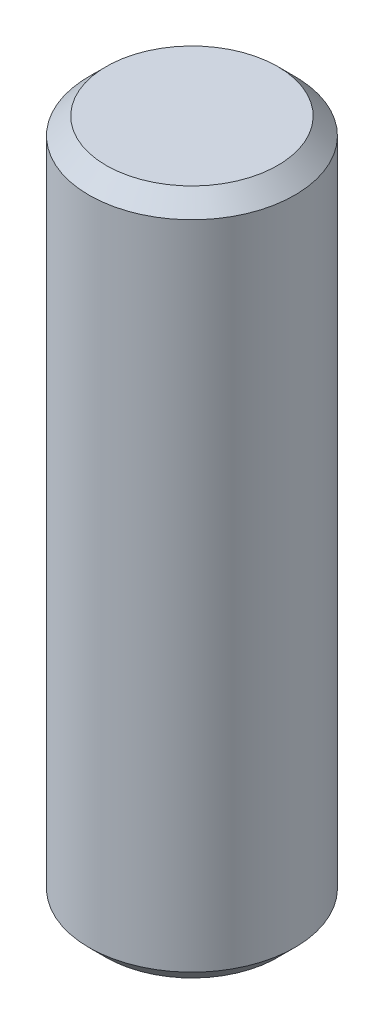
ISO-10303-21;
HEADER;
FILE_DESCRIPTION(('STEP AP214'),'2;1');
FILE_NAME('part.step','',(''),(''),'','','');
FILE_SCHEMA(('AUTOMOTIVE_DESIGN { 1 0 10303 214 1 1 1 1 }'));
ENDSEC;
DATA;
#1=APPLICATION_CONTEXT('core data for automotive mechanical design processes');
#2=APPLICATION_PROTOCOL_DEFINITION('international standard','automotive_design',2000,#1);
#3=PRODUCT_CONTEXT('',#1,'mechanical');
#4=PRODUCT('Part','Part','',(#3));
#5=PRODUCT_RELATED_PRODUCT_CATEGORY('part','',(#4));
#6=PRODUCT_DEFINITION_FORMATION('','',#4);
#7=PRODUCT_DEFINITION_CONTEXT('part definition',#1,'design');
#8=PRODUCT_DEFINITION('design','',#6,#7);
#9=PRODUCT_DEFINITION_SHAPE('','',#8);
#10=(LENGTH_UNIT() NAMED_UNIT(*) SI_UNIT(.MILLI.,.METRE.));
#11=(NAMED_UNIT(*) PLANE_ANGLE_UNIT() SI_UNIT($,.RADIAN.));
#12=(NAMED_UNIT(*) SI_UNIT($,.STERADIAN.) SOLID_ANGLE_UNIT());
#13=UNCERTAINTY_MEASURE_WITH_UNIT(LENGTH_MEASURE(1.E-05),#10,'distance_accuracy_value','');
#14=(GEOMETRIC_REPRESENTATION_CONTEXT(3) GLOBAL_UNCERTAINTY_ASSIGNED_CONTEXT((#13)) GLOBAL_UNIT_ASSIGNED_CONTEXT((#10,
#11,#12)) REPRESENTATION_CONTEXT('',''));
#15=CARTESIAN_POINT('',(0.,0.,0.));
#16=DIRECTION('',(0.,0.,1.));
#17=DIRECTION('',(1.,0.,0.));
#18=AXIS2_PLACEMENT_3D('',#15,#16,#17);
#19=CARTESIAN_POINT('',(0.,10.,0.));
#20=DIRECTION('',(0.,-1.,0.));
#21=DIRECTION('',(0.,0.,-1.));
#22=AXIS2_PLACEMENT_3D('',#19,#20,#21);
#23=CYLINDRICAL_SURFACE('',#22,3.);
#24=CARTESIAN_POINT('',(0.,-9.5,0.));
#25=DIRECTION('',(0.,1.,0.));
#26=DIRECTION('',(0.,0.,1.));
#27=AXIS2_PLACEMENT_3D('',#24,#25,#26);
#28=CIRCLE('',#27,3.);
#29=CARTESIAN_POINT('',(0.,-9.5,3.));
#30=VERTEX_POINT('',#29);
#31=EDGE_CURVE('E53',#30,#30,#28,.T.);
#32=ORIENTED_EDGE('',*,*,#31,.T.);
#33=EDGE_LOOP('',(#32));
#34=FACE_BOUND('',#33,.T.);
#35=CARTESIAN_POINT('',(0.,9.5,0.));
#36=DIRECTION('',(0.,1.,0.));
#37=DIRECTION('',(0.,0.,1.));
#38=AXIS2_PLACEMENT_3D('',#35,#36,#37);
#39=CIRCLE('',#38,3.);
#40=CARTESIAN_POINT('',(0.,9.5,3.));
#41=VERTEX_POINT('',#40);
#42=EDGE_CURVE('E57',#41,#41,#39,.F.);
#43=ORIENTED_EDGE('',*,*,#42,.T.);
#44=EDGE_LOOP('',(#43));
#45=FACE_BOUND('',#44,.T.);
#46=ADVANCED_FACE('F41',(#34,#45),#23,.T.);
#47=CARTESIAN_POINT('',(0.,10.,0.));
#48=DIRECTION('',(0.,1.,0.));
#49=DIRECTION('',(0.,0.,1.));
#50=AXIS2_PLACEMENT_3D('',#47,#48,#49);
#51=PLANE('',#50);
#52=CARTESIAN_POINT('',(0.,10.,0.));
#53=DIRECTION('',(0.,1.,0.));
#54=DIRECTION('',(0.,0.,1.));
#55=AXIS2_PLACEMENT_3D('',#52,#53,#54);
#56=CIRCLE('',#55,2.5);
#57=CARTESIAN_POINT('',(0.,10.,2.5));
#58=VERTEX_POINT('',#57);
#59=EDGE_CURVE('E10',#58,#58,#56,.T.);
#60=ORIENTED_EDGE('',*,*,#59,.T.);
#61=EDGE_LOOP('',(#60));
#62=FACE_BOUND('',#61,.T.);
#63=ADVANCED_FACE('F73',(#62),#51,.T.);
#64=CARTESIAN_POINT('',(0.,-10.,0.));
#65=DIRECTION('',(0.,1.,0.));
#66=DIRECTION('',(0.,0.,1.));
#67=AXIS2_PLACEMENT_3D('',#64,#65,#66);
#68=PLANE('',#67);
#69=CARTESIAN_POINT('',(0.,-10.,0.));
#70=DIRECTION('',(0.,1.,0.));
#71=DIRECTION('',(0.,0.,1.));
#72=AXIS2_PLACEMENT_3D('',#69,#70,#71);
#73=CIRCLE('',#72,2.5);
#74=CARTESIAN_POINT('',(0.,-10.,2.5));
#75=VERTEX_POINT('',#74);
#76=EDGE_CURVE('E49',#75,#75,#73,.F.);
#77=ORIENTED_EDGE('',*,*,#76,.T.);
#78=EDGE_LOOP('',(#77));
#79=FACE_BOUND('',#78,.T.);
#80=ADVANCED_FACE('F70',(#79),#68,.F.);
#81=CARTESIAN_POINT('',(0.,-9.5,0.));
#82=DIRECTION('',(0.,1.,0.));
#83=DIRECTION('',(0.,0.,1.));
#84=AXIS2_PLACEMENT_3D('',#81,#82,#83);
#85=CONICAL_SURFACE('',#84,3.,0.785398163397451);
#86=ORIENTED_EDGE('',*,*,#76,.F.);
#87=EDGE_LOOP('',(#86));
#88=FACE_BOUND('',#87,.T.);
#89=ORIENTED_EDGE('',*,*,#31,.F.);
#90=EDGE_LOOP('',(#89));
#91=FACE_BOUND('',#90,.T.);
#92=ADVANCED_FACE('F66',(#88,#91),#85,.T.);
#93=CARTESIAN_POINT('',(0.,10.,0.));
#94=DIRECTION('',(0.,-1.,0.));
#95=DIRECTION('',(0.,0.,-1.));
#96=AXIS2_PLACEMENT_3D('',#93,#94,#95);
#97=CONICAL_SURFACE('',#96,2.5,0.785398163397451);
#98=ORIENTED_EDGE('',*,*,#42,.F.);
#99=EDGE_LOOP('',(#98));
#100=FACE_BOUND('',#99,.T.);
#101=ORIENTED_EDGE('',*,*,#59,.F.);
#102=EDGE_LOOP('',(#101));
#103=FACE_BOUND('',#102,.T.);
#104=ADVANCED_FACE('F44',(#100,#103),#97,.T.);
#105=CLOSED_SHELL('',(#46,#63,#80,#92,#104));
#106=MANIFOLD_SOLID_BREP('B2',#105);
#107=ADVANCED_BREP_SHAPE_REPRESENTATION('',(#18,#106),#14);
#108=SHAPE_DEFINITION_REPRESENTATION(#9,#107);
ENDSEC;
END-ISO-10303-21;
